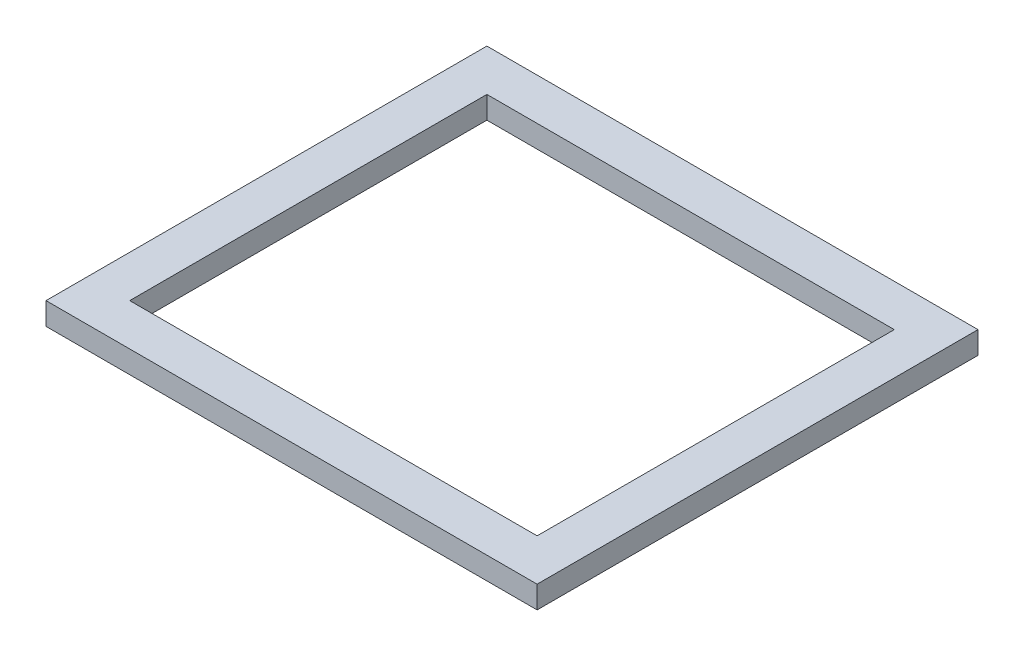
ISO-10303-21;
HEADER;
FILE_DESCRIPTION(('STEP AP214'),'2;1');
FILE_NAME('part.step','',(''),(''),'','','');
FILE_SCHEMA(('AUTOMOTIVE_DESIGN { 1 0 10303 214 1 1 1 1 }'));
ENDSEC;
DATA;
#1=APPLICATION_CONTEXT('core data for automotive mechanical design processes');
#2=APPLICATION_PROTOCOL_DEFINITION('international standard','automotive_design',2000,#1);
#3=PRODUCT_CONTEXT('',#1,'mechanical');
#4=PRODUCT('Part','Part','',(#3));
#5=PRODUCT_RELATED_PRODUCT_CATEGORY('part','',(#4));
#6=PRODUCT_DEFINITION_FORMATION('','',#4);
#7=PRODUCT_DEFINITION_CONTEXT('part definition',#1,'design');
#8=PRODUCT_DEFINITION('design','',#6,#7);
#9=PRODUCT_DEFINITION_SHAPE('','',#8);
#10=(LENGTH_UNIT() NAMED_UNIT(*) SI_UNIT(.MILLI.,.METRE.));
#11=(NAMED_UNIT(*) PLANE_ANGLE_UNIT() SI_UNIT($,.RADIAN.));
#12=(NAMED_UNIT(*) SI_UNIT($,.STERADIAN.) SOLID_ANGLE_UNIT());
#13=UNCERTAINTY_MEASURE_WITH_UNIT(LENGTH_MEASURE(1.E-05),#10,'distance_accuracy_value','');
#14=(GEOMETRIC_REPRESENTATION_CONTEXT(3) GLOBAL_UNCERTAINTY_ASSIGNED_CONTEXT((#13)) GLOBAL_UNIT_ASSIGNED_CONTEXT((#10,
#11,#12)) REPRESENTATION_CONTEXT('',''));
#15=CARTESIAN_POINT('',(0.,0.,0.));
#16=DIRECTION('',(0.,0.,1.));
#17=DIRECTION('',(1.,0.,0.));
#18=AXIS2_PLACEMENT_3D('',#15,#16,#17);
#19=CARTESIAN_POINT('',(0.,0.8,0.));
#20=DIRECTION('',(0.,1.,0.));
#21=DIRECTION('',(0.,0.,1.));
#22=AXIS2_PLACEMENT_3D('',#19,#20,#21);
#23=PLANE('',#22);
#24=DIRECTION('',(0.,0.,1.));
#25=VECTOR('',#24,1.);
#26=CARTESIAN_POINT('',(-8.80000000000001,0.8,-7.9));
#27=LINE('',#26,#25);
#28=CARTESIAN_POINT('',(-8.80000000000001,0.8,-7.9));
#29=VERTEX_POINT('',#28);
#30=CARTESIAN_POINT('',(-8.8,0.8,7.9));
#31=VERTEX_POINT('',#30);
#32=EDGE_CURVE('E189',#29,#31,#27,.T.);
#33=ORIENTED_EDGE('',*,*,#32,.T.);
#34=DIRECTION('',(1.,0.,0.));
#35=VECTOR('',#34,1.);
#36=CARTESIAN_POINT('',(-8.8,0.8,7.9));
#37=LINE('',#36,#35);
#38=CARTESIAN_POINT('',(8.8,0.8,7.9));
#39=VERTEX_POINT('',#38);
#40=EDGE_CURVE('E193',#31,#39,#37,.T.);
#41=ORIENTED_EDGE('',*,*,#40,.T.);
#42=DIRECTION('',(0.,0.,-1.));
#43=VECTOR('',#42,1.);
#44=CARTESIAN_POINT('',(8.8,0.8,-7.9));
#45=LINE('',#44,#43);
#46=CARTESIAN_POINT('',(8.8,0.8,-7.9));
#47=VERTEX_POINT('',#46);
#48=EDGE_CURVE('E197',#39,#47,#45,.T.);
#49=ORIENTED_EDGE('',*,*,#48,.T.);
#50=DIRECTION('',(-1.,0.,0.));
#51=VECTOR('',#50,1.);
#52=CARTESIAN_POINT('',(-8.80000000000001,0.8,-7.9));
#53=LINE('',#52,#51);
#54=EDGE_CURVE('E200',#47,#29,#53,.T.);
#55=ORIENTED_EDGE('',*,*,#54,.T.);
#56=EDGE_LOOP('',(#33,#41,#49,#55));
#57=FACE_BOUND('',#56,.T.);
#58=DIRECTION('',(1.,0.,0.));
#59=VECTOR('',#58,1.);
#60=CARTESIAN_POINT('',(-8.8,0.8,6.4));
#61=LINE('',#60,#59);
#62=CARTESIAN_POINT('',(-7.3,0.8,6.4));
#63=VERTEX_POINT('',#62);
#64=CARTESIAN_POINT('',(7.3,0.8,6.4));
#65=VERTEX_POINT('',#64);
#66=EDGE_CURVE('E150',#63,#65,#61,.T.);
#67=ORIENTED_EDGE('',*,*,#66,.F.);
#68=DIRECTION('',(0.,0.,1.));
#69=VECTOR('',#68,1.);
#70=CARTESIAN_POINT('',(-7.30000000000001,0.8,-7.9));
#71=LINE('',#70,#69);
#72=CARTESIAN_POINT('',(-7.30000000000001,0.8,-6.4));
#73=VERTEX_POINT('',#72);
#74=EDGE_CURVE('E141',#73,#63,#71,.T.);
#75=ORIENTED_EDGE('',*,*,#74,.F.);
#76=DIRECTION('',(-1.,0.,0.));
#77=VECTOR('',#76,1.);
#78=CARTESIAN_POINT('',(-8.80000000000001,0.8,-6.4));
#79=LINE('',#78,#77);
#80=CARTESIAN_POINT('',(7.3,0.8,-6.4));
#81=VERTEX_POINT('',#80);
#82=EDGE_CURVE('E167',#81,#73,#79,.T.);
#83=ORIENTED_EDGE('',*,*,#82,.F.);
#84=DIRECTION('',(0.,0.,-1.));
#85=VECTOR('',#84,1.);
#86=CARTESIAN_POINT('',(7.3,0.8,-7.9));
#87=LINE('',#86,#85);
#88=EDGE_CURVE('E163',#65,#81,#87,.T.);
#89=ORIENTED_EDGE('',*,*,#88,.F.);
#90=EDGE_LOOP('',(#67,#75,#83,#89));
#91=FACE_BOUND('',#90,.T.);
#92=ADVANCED_FACE('F75',(#57,#91),#23,.T.);
#93=CARTESIAN_POINT('',(0.,0.,0.));
#94=DIRECTION('',(0.,1.,0.));
#95=DIRECTION('',(0.,0.,1.));
#96=AXIS2_PLACEMENT_3D('',#93,#94,#95);
#97=PLANE('',#96);
#98=DIRECTION('',(0.,0.,1.));
#99=VECTOR('',#98,1.);
#100=CARTESIAN_POINT('',(-8.80000000000001,0.,-7.9));
#101=LINE('',#100,#99);
#102=CARTESIAN_POINT('',(-8.80000000000001,0.,-7.9));
#103=VERTEX_POINT('',#102);
#104=CARTESIAN_POINT('',(-8.8,0.,7.9));
#105=VERTEX_POINT('',#104);
#106=EDGE_CURVE('E159',#103,#105,#101,.T.);
#107=ORIENTED_EDGE('',*,*,#106,.F.);
#108=DIRECTION('',(-1.,0.,0.));
#109=VECTOR('',#108,1.);
#110=CARTESIAN_POINT('',(-8.80000000000001,0.,-7.9));
#111=LINE('',#110,#109);
#112=CARTESIAN_POINT('',(8.8,0.,-7.9));
#113=VERTEX_POINT('',#112);
#114=EDGE_CURVE('E194',#113,#103,#111,.T.);
#115=ORIENTED_EDGE('',*,*,#114,.F.);
#116=DIRECTION('',(0.,0.,-1.));
#117=VECTOR('',#116,1.);
#118=CARTESIAN_POINT('',(8.8,0.,-7.9));
#119=LINE('',#118,#117);
#120=CARTESIAN_POINT('',(8.8,0.,7.9));
#121=VERTEX_POINT('',#120);
#122=EDGE_CURVE('E210',#121,#113,#119,.T.);
#123=ORIENTED_EDGE('',*,*,#122,.F.);
#124=DIRECTION('',(1.,0.,0.));
#125=VECTOR('',#124,1.);
#126=CARTESIAN_POINT('',(-8.8,0.,7.9));
#127=LINE('',#126,#125);
#128=EDGE_CURVE('E207',#105,#121,#127,.T.);
#129=ORIENTED_EDGE('',*,*,#128,.F.);
#130=EDGE_LOOP('',(#107,#115,#123,#129));
#131=FACE_BOUND('',#130,.T.);
#132=DIRECTION('',(0.,0.,1.));
#133=VECTOR('',#132,1.);
#134=CARTESIAN_POINT('',(-7.30000000000001,0.,-7.9));
#135=LINE('',#134,#133);
#136=CARTESIAN_POINT('',(-7.30000000000001,0.,-6.4));
#137=VERTEX_POINT('',#136);
#138=CARTESIAN_POINT('',(-7.3,0.,6.4));
#139=VERTEX_POINT('',#138);
#140=EDGE_CURVE('E99',#137,#139,#135,.T.);
#141=ORIENTED_EDGE('',*,*,#140,.T.);
#142=DIRECTION('',(1.,0.,0.));
#143=VECTOR('',#142,1.);
#144=CARTESIAN_POINT('',(-8.8,0.,6.4));
#145=LINE('',#144,#143);
#146=CARTESIAN_POINT('',(7.3,0.,6.4));
#147=VERTEX_POINT('',#146);
#148=EDGE_CURVE('E157',#139,#147,#145,.T.);
#149=ORIENTED_EDGE('',*,*,#148,.T.);
#150=DIRECTION('',(0.,0.,-1.));
#151=VECTOR('',#150,1.);
#152=CARTESIAN_POINT('',(7.3,0.,-7.9));
#153=LINE('',#152,#151);
#154=CARTESIAN_POINT('',(7.3,0.,-6.4));
#155=VERTEX_POINT('',#154);
#156=EDGE_CURVE('E176',#147,#155,#153,.T.);
#157=ORIENTED_EDGE('',*,*,#156,.T.);
#158=DIRECTION('',(-1.,0.,0.));
#159=VECTOR('',#158,1.);
#160=CARTESIAN_POINT('',(-8.80000000000001,0.,-6.4));
#161=LINE('',#160,#159);
#162=EDGE_CURVE('E151',#155,#137,#161,.T.);
#163=ORIENTED_EDGE('',*,*,#162,.T.);
#164=EDGE_LOOP('',(#141,#149,#157,#163));
#165=FACE_BOUND('',#164,.T.);
#166=ADVANCED_FACE('F233',(#131,#165),#97,.F.);
#167=CARTESIAN_POINT('',(-8.80000000000001,0.8,-7.9));
#168=DIRECTION('',(1.,0.,0.));
#169=DIRECTION('',(0.,0.,-1.));
#170=AXIS2_PLACEMENT_3D('',#167,#168,#169);
#171=PLANE('',#170);
#172=ORIENTED_EDGE('',*,*,#106,.T.);
#173=DIRECTION('',(0.,-1.,0.));
#174=VECTOR('',#173,1.);
#175=CARTESIAN_POINT('',(-8.8,0.8,7.9));
#176=LINE('',#175,#174);
#177=EDGE_CURVE('E12',#31,#105,#176,.T.);
#178=ORIENTED_EDGE('',*,*,#177,.F.);
#179=ORIENTED_EDGE('',*,*,#32,.F.);
#180=DIRECTION('',(0.,-1.,0.));
#181=VECTOR('',#180,1.);
#182=CARTESIAN_POINT('',(-8.80000000000001,0.8,-7.9));
#183=LINE('',#182,#181);
#184=EDGE_CURVE('E203',#29,#103,#183,.T.);
#185=ORIENTED_EDGE('',*,*,#184,.T.);
#186=EDGE_LOOP('',(#172,#178,#179,#185));
#187=FACE_BOUND('',#186,.T.);
#188=ADVANCED_FACE('F77',(#187),#171,.F.);
#189=CARTESIAN_POINT('',(-8.8,0.8,7.9));
#190=DIRECTION('',(0.,0.,-1.));
#191=DIRECTION('',(-1.,0.,0.));
#192=AXIS2_PLACEMENT_3D('',#189,#190,#191);
#193=PLANE('',#192);
#194=ORIENTED_EDGE('',*,*,#128,.T.);
#195=DIRECTION('',(0.,-1.,0.));
#196=VECTOR('',#195,1.);
#197=CARTESIAN_POINT('',(8.8,0.8,7.9));
#198=LINE('',#197,#196);
#199=EDGE_CURVE('E84',#39,#121,#198,.T.);
#200=ORIENTED_EDGE('',*,*,#199,.F.);
#201=ORIENTED_EDGE('',*,*,#40,.F.);
#202=ORIENTED_EDGE('',*,*,#177,.T.);
#203=EDGE_LOOP('',(#194,#200,#201,#202));
#204=FACE_BOUND('',#203,.T.);
#205=ADVANCED_FACE('F243',(#204),#193,.F.);
#206=CARTESIAN_POINT('',(8.8,0.8,-7.9));
#207=DIRECTION('',(-1.,0.,0.));
#208=DIRECTION('',(0.,0.,1.));
#209=AXIS2_PLACEMENT_3D('',#206,#207,#208);
#210=PLANE('',#209);
#211=ORIENTED_EDGE('',*,*,#122,.T.);
#212=DIRECTION('',(0.,-1.,0.));
#213=VECTOR('',#212,1.);
#214=CARTESIAN_POINT('',(8.8,0.8,-7.9));
#215=LINE('',#214,#213);
#216=EDGE_CURVE('E218',#47,#113,#215,.T.);
#217=ORIENTED_EDGE('',*,*,#216,.F.);
#218=ORIENTED_EDGE('',*,*,#48,.F.);
#219=ORIENTED_EDGE('',*,*,#199,.T.);
#220=EDGE_LOOP('',(#211,#217,#218,#219));
#221=FACE_BOUND('',#220,.T.);
#222=ADVANCED_FACE('F227',(#221),#210,.F.);
#223=CARTESIAN_POINT('',(-8.80000000000001,0.8,-7.9));
#224=DIRECTION('',(0.,0.,1.));
#225=DIRECTION('',(1.,0.,0.));
#226=AXIS2_PLACEMENT_3D('',#223,#224,#225);
#227=PLANE('',#226);
#228=ORIENTED_EDGE('',*,*,#114,.T.);
#229=ORIENTED_EDGE('',*,*,#184,.F.);
#230=ORIENTED_EDGE('',*,*,#54,.F.);
#231=ORIENTED_EDGE('',*,*,#216,.T.);
#232=EDGE_LOOP('',(#228,#229,#230,#231));
#233=FACE_BOUND('',#232,.T.);
#234=ADVANCED_FACE('F237',(#233),#227,.F.);
#235=CARTESIAN_POINT('',(-7.30000000000001,0.8,-7.9));
#236=DIRECTION('',(1.,0.,0.));
#237=DIRECTION('',(0.,0.,-1.));
#238=AXIS2_PLACEMENT_3D('',#235,#236,#237);
#239=PLANE('',#238);
#240=ORIENTED_EDGE('',*,*,#140,.F.);
#241=DIRECTION('',(0.,-1.,0.));
#242=VECTOR('',#241,1.);
#243=CARTESIAN_POINT('',(-7.30000000000001,0.8,-6.4));
#244=LINE('',#243,#242);
#245=EDGE_CURVE('E145',#73,#137,#244,.T.);
#246=ORIENTED_EDGE('',*,*,#245,.F.);
#247=ORIENTED_EDGE('',*,*,#74,.T.);
#248=DIRECTION('',(0.,-1.,0.));
#249=VECTOR('',#248,1.);
#250=CARTESIAN_POINT('',(-7.3,0.8,6.4));
#251=LINE('',#250,#249);
#252=EDGE_CURVE('E144',#63,#139,#251,.T.);
#253=ORIENTED_EDGE('',*,*,#252,.T.);
#254=EDGE_LOOP('',(#240,#246,#247,#253));
#255=FACE_BOUND('',#254,.T.);
#256=ADVANCED_FACE('F143',(#255),#239,.T.);
#257=CARTESIAN_POINT('',(-8.8,0.8,6.4));
#258=DIRECTION('',(0.,0.,-1.));
#259=DIRECTION('',(-1.,0.,0.));
#260=AXIS2_PLACEMENT_3D('',#257,#258,#259);
#261=PLANE('',#260);
#262=ORIENTED_EDGE('',*,*,#148,.F.);
#263=ORIENTED_EDGE('',*,*,#252,.F.);
#264=ORIENTED_EDGE('',*,*,#66,.T.);
#265=DIRECTION('',(0.,-1.,0.));
#266=VECTOR('',#265,1.);
#267=CARTESIAN_POINT('',(7.3,0.8,6.4));
#268=LINE('',#267,#266);
#269=EDGE_CURVE('E160',#65,#147,#268,.T.);
#270=ORIENTED_EDGE('',*,*,#269,.T.);
#271=EDGE_LOOP('',(#262,#263,#264,#270));
#272=FACE_BOUND('',#271,.T.);
#273=ADVANCED_FACE('F154',(#272),#261,.T.);
#274=CARTESIAN_POINT('',(7.3,0.8,-7.9));
#275=DIRECTION('',(-1.,0.,0.));
#276=DIRECTION('',(0.,0.,1.));
#277=AXIS2_PLACEMENT_3D('',#274,#275,#276);
#278=PLANE('',#277);
#279=ORIENTED_EDGE('',*,*,#156,.F.);
#280=ORIENTED_EDGE('',*,*,#269,.F.);
#281=ORIENTED_EDGE('',*,*,#88,.T.);
#282=DIRECTION('',(0.,-1.,0.));
#283=VECTOR('',#282,1.);
#284=CARTESIAN_POINT('',(7.3,0.8,-6.4));
#285=LINE('',#284,#283);
#286=EDGE_CURVE('E91',#81,#155,#285,.T.);
#287=ORIENTED_EDGE('',*,*,#286,.T.);
#288=EDGE_LOOP('',(#279,#280,#281,#287));
#289=FACE_BOUND('',#288,.T.);
#290=ADVANCED_FACE('F267',(#289),#278,.T.);
#291=CARTESIAN_POINT('',(-8.80000000000001,0.8,-6.4));
#292=DIRECTION('',(0.,0.,1.));
#293=DIRECTION('',(1.,0.,0.));
#294=AXIS2_PLACEMENT_3D('',#291,#292,#293);
#295=PLANE('',#294);
#296=ORIENTED_EDGE('',*,*,#162,.F.);
#297=ORIENTED_EDGE('',*,*,#286,.F.);
#298=ORIENTED_EDGE('',*,*,#82,.T.);
#299=ORIENTED_EDGE('',*,*,#245,.T.);
#300=EDGE_LOOP('',(#296,#297,#298,#299));
#301=FACE_BOUND('',#300,.T.);
#302=ADVANCED_FACE('F271',(#301),#295,.T.);
#303=CLOSED_SHELL('',(#92,#166,#188,#205,#222,#234,#256,#273,#290,#302));
#304=MANIFOLD_SOLID_BREP('B2',#303);
#305=ADVANCED_BREP_SHAPE_REPRESENTATION('',(#18,#304),#14);
#306=SHAPE_DEFINITION_REPRESENTATION(#9,#305);
ENDSEC;
END-ISO-10303-21;
